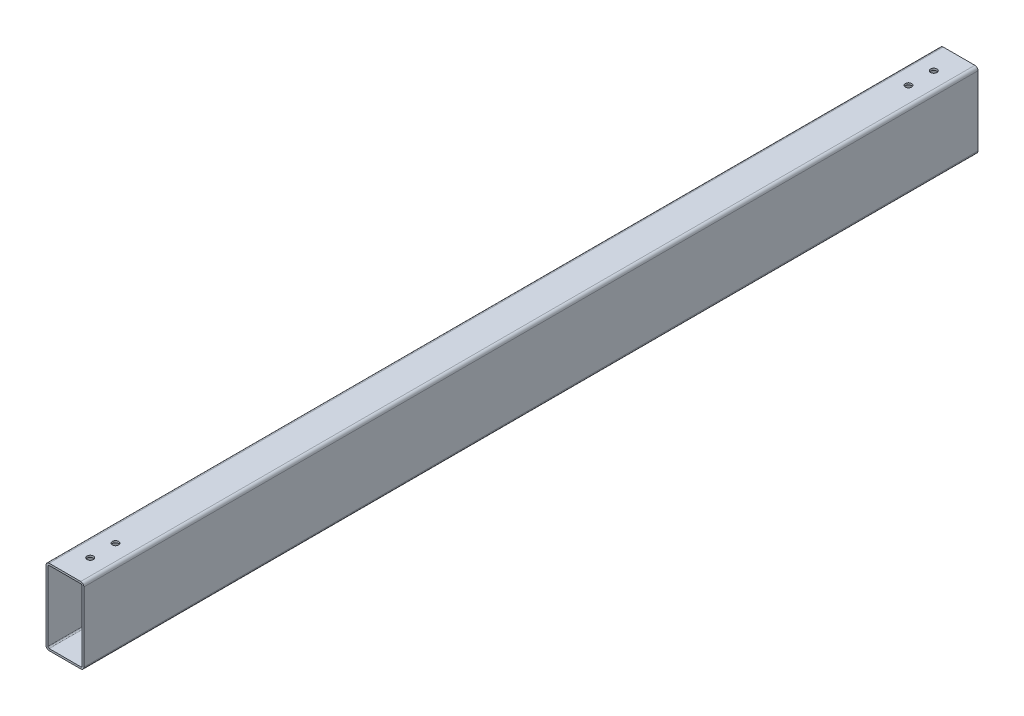
ISO-10303-21;
HEADER;
FILE_DESCRIPTION(('STEP AP214'),'2;1');
FILE_NAME('part.step','',(''),(''),'','','');
FILE_SCHEMA(('AUTOMOTIVE_DESIGN { 1 0 10303 214 1 1 1 1 }'));
ENDSEC;
DATA;
#1=APPLICATION_CONTEXT('core data for automotive mechanical design processes');
#2=APPLICATION_PROTOCOL_DEFINITION('international standard','automotive_design',2000,#1);
#3=PRODUCT_CONTEXT('',#1,'mechanical');
#4=PRODUCT('Part','Part','',(#3));
#5=PRODUCT_RELATED_PRODUCT_CATEGORY('part','',(#4));
#6=PRODUCT_DEFINITION_FORMATION('','',#4);
#7=PRODUCT_DEFINITION_CONTEXT('part definition',#1,'design');
#8=PRODUCT_DEFINITION('design','',#6,#7);
#9=PRODUCT_DEFINITION_SHAPE('','',#8);
#10=(LENGTH_UNIT() NAMED_UNIT(*) SI_UNIT(.MILLI.,.METRE.));
#11=(NAMED_UNIT(*) PLANE_ANGLE_UNIT() SI_UNIT($,.RADIAN.));
#12=(NAMED_UNIT(*) SI_UNIT($,.STERADIAN.) SOLID_ANGLE_UNIT());
#13=UNCERTAINTY_MEASURE_WITH_UNIT(LENGTH_MEASURE(1.E-05),#10,'distance_accuracy_value','');
#14=(GEOMETRIC_REPRESENTATION_CONTEXT(3) GLOBAL_UNCERTAINTY_ASSIGNED_CONTEXT((#13)) GLOBAL_UNIT_ASSIGNED_CONTEXT((#10,
#11,#12)) REPRESENTATION_CONTEXT('',''));
#15=CARTESIAN_POINT('',(0.,0.,0.));
#16=DIRECTION('',(0.,0.,1.));
#17=DIRECTION('',(1.,0.,0.));
#18=AXIS2_PLACEMENT_3D('',#15,#16,#17);
#19=CARTESIAN_POINT('',(-25.,55.,-708.));
#20=DIRECTION('',(0.,0.,1.));
#21=DIRECTION('',(1.,0.,0.));
#22=AXIS2_PLACEMENT_3D('',#19,#20,#21);
#23=CYLINDRICAL_SURFACE('',#22,5.);
#24=DIRECTION('',(0.,0.,1.));
#25=VECTOR('',#24,1.);
#26=CARTESIAN_POINT('',(-30.,55.,-708.));
#27=LINE('',#26,#25);
#28=CARTESIAN_POINT('',(-30.,55.,-708.));
#29=VERTEX_POINT('',#28);
#30=CARTESIAN_POINT('',(-30.,55.,708.));
#31=VERTEX_POINT('',#30);
#32=EDGE_CURVE('E132',#29,#31,#27,.T.);
#33=ORIENTED_EDGE('',*,*,#32,.T.);
#34=CARTESIAN_POINT('',(-25.,55.,708.));
#35=DIRECTION('',(0.,0.,1.));
#36=DIRECTION('',(-1.,0.,0.));
#37=AXIS2_PLACEMENT_3D('',#34,#35,#36);
#38=CIRCLE('',#37,5.);
#39=CARTESIAN_POINT('',(-25.,60.,708.));
#40=VERTEX_POINT('',#39);
#41=EDGE_CURVE('E287',#40,#31,#38,.T.);
#42=ORIENTED_EDGE('',*,*,#41,.F.);
#43=DIRECTION('',(0.,0.,1.));
#44=VECTOR('',#43,1.);
#45=CARTESIAN_POINT('',(-25.,60.,-708.));
#46=LINE('',#45,#44);
#47=CARTESIAN_POINT('',(-25.,60.,-708.));
#48=VERTEX_POINT('',#47);
#49=EDGE_CURVE('E12',#48,#40,#46,.T.);
#50=ORIENTED_EDGE('',*,*,#49,.F.);
#51=CARTESIAN_POINT('',(-25.,55.,-708.));
#52=DIRECTION('',(0.,0.,1.));
#53=DIRECTION('',(-1.,0.,0.));
#54=AXIS2_PLACEMENT_3D('',#51,#52,#53);
#55=CIRCLE('',#54,5.);
#56=EDGE_CURVE('E330',#48,#29,#55,.T.);
#57=ORIENTED_EDGE('',*,*,#56,.T.);
#58=EDGE_LOOP('',(#33,#42,#50,#57));
#59=FACE_BOUND('',#58,.T.);
#60=ADVANCED_FACE('F129',(#59),#23,.T.);
#61=CARTESIAN_POINT('',(-25.,60.,-708.));
#62=DIRECTION('',(0.,1.,0.));
#63=DIRECTION('',(0.,0.,1.));
#64=AXIS2_PLACEMENT_3D('',#61,#62,#63);
#65=PLANE('',#64);
#66=CARTESIAN_POINT('',(0.,60.,-668.));
#67=DIRECTION('',(0.,1.,0.));
#68=DIRECTION('',(0.,0.,1.));
#69=AXIS2_PLACEMENT_3D('',#66,#67,#68);
#70=CIRCLE('',#69,5.);
#71=CARTESIAN_POINT('',(0.,60.,-663.));
#72=VERTEX_POINT('',#71);
#73=EDGE_CURVE('E609',#72,#72,#70,.T.);
#74=ORIENTED_EDGE('',*,*,#73,.F.);
#75=EDGE_LOOP('',(#74));
#76=FACE_BOUND('',#75,.T.);
#77=CARTESIAN_POINT('',(0.,60.,-628.));
#78=DIRECTION('',(0.,1.,0.));
#79=DIRECTION('',(0.,0.,1.));
#80=AXIS2_PLACEMENT_3D('',#77,#78,#79);
#81=CIRCLE('',#80,5.);
#82=CARTESIAN_POINT('',(0.,60.,-623.));
#83=VERTEX_POINT('',#82);
#84=EDGE_CURVE('E616',#83,#83,#81,.T.);
#85=ORIENTED_EDGE('',*,*,#84,.F.);
#86=EDGE_LOOP('',(#85));
#87=FACE_BOUND('',#86,.T.);
#88=CARTESIAN_POINT('',(0.,60.,628.));
#89=DIRECTION('',(0.,1.,0.));
#90=DIRECTION('',(0.,0.,-1.));
#91=AXIS2_PLACEMENT_3D('',#88,#89,#90);
#92=CIRCLE('',#91,5.);
#93=CARTESIAN_POINT('',(0.,60.,623.));
#94=VERTEX_POINT('',#93);
#95=EDGE_CURVE('E622',#94,#94,#92,.T.);
#96=ORIENTED_EDGE('',*,*,#95,.F.);
#97=EDGE_LOOP('',(#96));
#98=FACE_BOUND('',#97,.T.);
#99=CARTESIAN_POINT('',(0.,60.,668.));
#100=DIRECTION('',(0.,1.,0.));
#101=DIRECTION('',(0.,0.,-1.));
#102=AXIS2_PLACEMENT_3D('',#99,#100,#101);
#103=CIRCLE('',#102,5.);
#104=CARTESIAN_POINT('',(0.,60.,663.));
#105=VERTEX_POINT('',#104);
#106=EDGE_CURVE('E628',#105,#105,#103,.T.);
#107=ORIENTED_EDGE('',*,*,#106,.F.);
#108=EDGE_LOOP('',(#107));
#109=FACE_BOUND('',#108,.T.);
#110=ORIENTED_EDGE('',*,*,#49,.T.);
#111=DIRECTION('',(-1.,0.,0.));
#112=VECTOR('',#111,1.);
#113=CARTESIAN_POINT('',(-25.,60.,708.));
#114=LINE('',#113,#112);
#115=CARTESIAN_POINT('',(25.,60.,708.));
#116=VERTEX_POINT('',#115);
#117=EDGE_CURVE('E308',#116,#40,#114,.T.);
#118=ORIENTED_EDGE('',*,*,#117,.F.);
#119=DIRECTION('',(0.,0.,1.));
#120=VECTOR('',#119,1.);
#121=CARTESIAN_POINT('',(25.,60.,-708.));
#122=LINE('',#121,#120);
#123=CARTESIAN_POINT('',(25.,60.,-708.));
#124=VERTEX_POINT('',#123);
#125=EDGE_CURVE('E137',#124,#116,#122,.T.);
#126=ORIENTED_EDGE('',*,*,#125,.F.);
#127=DIRECTION('',(-1.,0.,0.));
#128=VECTOR('',#127,1.);
#129=CARTESIAN_POINT('',(-25.,60.,-708.));
#130=LINE('',#129,#128);
#131=EDGE_CURVE('E361',#124,#48,#130,.T.);
#132=ORIENTED_EDGE('',*,*,#131,.T.);
#133=EDGE_LOOP('',(#110,#118,#126,#132));
#134=FACE_BOUND('',#133,.T.);
#135=ADVANCED_FACE('F382',(#76,#87,#98,#109,#134),#65,.T.);
#136=CARTESIAN_POINT('',(25.,55.,-708.));
#137=DIRECTION('',(0.,0.,1.));
#138=DIRECTION('',(1.,0.,0.));
#139=AXIS2_PLACEMENT_3D('',#136,#137,#138);
#140=CYLINDRICAL_SURFACE('',#139,5.);
#141=ORIENTED_EDGE('',*,*,#125,.T.);
#142=CARTESIAN_POINT('',(25.,55.,708.));
#143=DIRECTION('',(0.,0.,1.));
#144=DIRECTION('',(-1.,0.,0.));
#145=AXIS2_PLACEMENT_3D('',#142,#143,#144);
#146=CIRCLE('',#145,5.);
#147=CARTESIAN_POINT('',(30.,55.,708.));
#148=VERTEX_POINT('',#147);
#149=EDGE_CURVE('E305',#148,#116,#146,.T.);
#150=ORIENTED_EDGE('',*,*,#149,.F.);
#151=DIRECTION('',(0.,0.,1.));
#152=VECTOR('',#151,1.);
#153=CARTESIAN_POINT('',(30.,55.,-708.));
#154=LINE('',#153,#152);
#155=CARTESIAN_POINT('',(30.,55.,-708.));
#156=VERTEX_POINT('',#155);
#157=EDGE_CURVE('E365',#156,#148,#154,.T.);
#158=ORIENTED_EDGE('',*,*,#157,.F.);
#159=CARTESIAN_POINT('',(25.,55.,-708.));
#160=DIRECTION('',(0.,0.,1.));
#161=DIRECTION('',(-1.,0.,0.));
#162=AXIS2_PLACEMENT_3D('',#159,#160,#161);
#163=CIRCLE('',#162,5.);
#164=EDGE_CURVE('E358',#156,#124,#163,.T.);
#165=ORIENTED_EDGE('',*,*,#164,.T.);
#166=EDGE_LOOP('',(#141,#150,#158,#165));
#167=FACE_BOUND('',#166,.T.);
#168=ADVANCED_FACE('F403',(#167),#140,.T.);
#169=CARTESIAN_POINT('',(30.,-55.,-708.));
#170=DIRECTION('',(1.,0.,0.));
#171=DIRECTION('',(0.,0.,-1.));
#172=AXIS2_PLACEMENT_3D('',#169,#170,#171);
#173=PLANE('',#172);
#174=ORIENTED_EDGE('',*,*,#157,.T.);
#175=DIRECTION('',(0.,1.,0.));
#176=VECTOR('',#175,1.);
#177=CARTESIAN_POINT('',(30.,-55.,708.));
#178=LINE('',#177,#176);
#179=CARTESIAN_POINT('',(30.,-55.,708.));
#180=VERTEX_POINT('',#179);
#181=EDGE_CURVE('E302',#180,#148,#178,.T.);
#182=ORIENTED_EDGE('',*,*,#181,.F.);
#183=DIRECTION('',(0.,0.,1.));
#184=VECTOR('',#183,1.);
#185=CARTESIAN_POINT('',(30.,-55.,-708.));
#186=LINE('',#185,#184);
#187=CARTESIAN_POINT('',(30.,-55.,-708.));
#188=VERTEX_POINT('',#187);
#189=EDGE_CURVE('E367',#188,#180,#186,.T.);
#190=ORIENTED_EDGE('',*,*,#189,.F.);
#191=DIRECTION('',(0.,1.,0.));
#192=VECTOR('',#191,1.);
#193=CARTESIAN_POINT('',(30.,-55.,-708.));
#194=LINE('',#193,#192);
#195=EDGE_CURVE('E355',#188,#156,#194,.T.);
#196=ORIENTED_EDGE('',*,*,#195,.T.);
#197=EDGE_LOOP('',(#174,#182,#190,#196));
#198=FACE_BOUND('',#197,.T.);
#199=ADVANCED_FACE('F400',(#198),#173,.T.);
#200=CARTESIAN_POINT('',(25.,-55.,-708.));
#201=DIRECTION('',(0.,0.,1.));
#202=DIRECTION('',(1.,0.,0.));
#203=AXIS2_PLACEMENT_3D('',#200,#201,#202);
#204=CYLINDRICAL_SURFACE('',#203,5.);
#205=ORIENTED_EDGE('',*,*,#189,.T.);
#206=CARTESIAN_POINT('',(25.,-55.,708.));
#207=DIRECTION('',(0.,0.,1.));
#208=DIRECTION('',(-1.,0.,0.));
#209=AXIS2_PLACEMENT_3D('',#206,#207,#208);
#210=CIRCLE('',#209,5.);
#211=CARTESIAN_POINT('',(25.,-60.,708.));
#212=VERTEX_POINT('',#211);
#213=EDGE_CURVE('E299',#212,#180,#210,.T.);
#214=ORIENTED_EDGE('',*,*,#213,.F.);
#215=DIRECTION('',(0.,0.,1.));
#216=VECTOR('',#215,1.);
#217=CARTESIAN_POINT('',(25.,-60.,-708.));
#218=LINE('',#217,#216);
#219=CARTESIAN_POINT('',(25.,-60.,-708.));
#220=VERTEX_POINT('',#219);
#221=EDGE_CURVE('E369',#220,#212,#218,.T.);
#222=ORIENTED_EDGE('',*,*,#221,.F.);
#223=CARTESIAN_POINT('',(25.,-55.,-708.));
#224=DIRECTION('',(0.,0.,1.));
#225=DIRECTION('',(-1.,0.,0.));
#226=AXIS2_PLACEMENT_3D('',#223,#224,#225);
#227=CIRCLE('',#226,5.);
#228=EDGE_CURVE('E352',#220,#188,#227,.T.);
#229=ORIENTED_EDGE('',*,*,#228,.T.);
#230=EDGE_LOOP('',(#205,#214,#222,#229));
#231=FACE_BOUND('',#230,.T.);
#232=ADVANCED_FACE('F398',(#231),#204,.T.);
#233=CARTESIAN_POINT('',(-25.,-60.,-708.));
#234=DIRECTION('',(0.,-1.,0.));
#235=DIRECTION('',(0.,0.,-1.));
#236=AXIS2_PLACEMENT_3D('',#233,#234,#235);
#237=PLANE('',#236);
#238=ORIENTED_EDGE('',*,*,#221,.T.);
#239=DIRECTION('',(1.,0.,0.));
#240=VECTOR('',#239,1.);
#241=CARTESIAN_POINT('',(-25.,-60.,708.));
#242=LINE('',#241,#240);
#243=CARTESIAN_POINT('',(-25.,-60.,708.));
#244=VERTEX_POINT('',#243);
#245=EDGE_CURVE('E296',#244,#212,#242,.T.);
#246=ORIENTED_EDGE('',*,*,#245,.F.);
#247=DIRECTION('',(0.,0.,1.));
#248=VECTOR('',#247,1.);
#249=CARTESIAN_POINT('',(-25.,-60.,-708.));
#250=LINE('',#249,#248);
#251=CARTESIAN_POINT('',(-25.,-60.,-708.));
#252=VERTEX_POINT('',#251);
#253=EDGE_CURVE('E371',#252,#244,#250,.T.);
#254=ORIENTED_EDGE('',*,*,#253,.F.);
#255=DIRECTION('',(1.,0.,0.));
#256=VECTOR('',#255,1.);
#257=CARTESIAN_POINT('',(-25.,-60.,-708.));
#258=LINE('',#257,#256);
#259=EDGE_CURVE('E349',#252,#220,#258,.T.);
#260=ORIENTED_EDGE('',*,*,#259,.T.);
#261=EDGE_LOOP('',(#238,#246,#254,#260));
#262=FACE_BOUND('',#261,.T.);
#263=ADVANCED_FACE('F396',(#262),#237,.T.);
#264=CARTESIAN_POINT('',(-25.,-55.,-708.));
#265=DIRECTION('',(0.,0.,1.));
#266=DIRECTION('',(1.,0.,0.));
#267=AXIS2_PLACEMENT_3D('',#264,#265,#266);
#268=CYLINDRICAL_SURFACE('',#267,5.);
#269=ORIENTED_EDGE('',*,*,#253,.T.);
#270=CARTESIAN_POINT('',(-25.,-55.,708.));
#271=DIRECTION('',(0.,0.,1.));
#272=DIRECTION('',(-1.,0.,0.));
#273=AXIS2_PLACEMENT_3D('',#270,#271,#272);
#274=CIRCLE('',#273,5.);
#275=CARTESIAN_POINT('',(-30.,-55.,708.));
#276=VERTEX_POINT('',#275);
#277=EDGE_CURVE('E293',#276,#244,#274,.T.);
#278=ORIENTED_EDGE('',*,*,#277,.F.);
#279=DIRECTION('',(0.,0.,1.));
#280=VECTOR('',#279,1.);
#281=CARTESIAN_POINT('',(-30.,-55.,-708.));
#282=LINE('',#281,#280);
#283=CARTESIAN_POINT('',(-30.,-55.,-708.));
#284=VERTEX_POINT('',#283);
#285=EDGE_CURVE('E372',#284,#276,#282,.T.);
#286=ORIENTED_EDGE('',*,*,#285,.F.);
#287=CARTESIAN_POINT('',(-25.,-55.,-708.));
#288=DIRECTION('',(0.,0.,1.));
#289=DIRECTION('',(-1.,0.,0.));
#290=AXIS2_PLACEMENT_3D('',#287,#288,#289);
#291=CIRCLE('',#290,5.);
#292=EDGE_CURVE('E346',#284,#252,#291,.T.);
#293=ORIENTED_EDGE('',*,*,#292,.T.);
#294=EDGE_LOOP('',(#269,#278,#286,#293));
#295=FACE_BOUND('',#294,.T.);
#296=ADVANCED_FACE('F392',(#295),#268,.T.);
#297=CARTESIAN_POINT('',(-30.,-55.,-708.));
#298=DIRECTION('',(-1.,0.,0.));
#299=DIRECTION('',(0.,0.,1.));
#300=AXIS2_PLACEMENT_3D('',#297,#298,#299);
#301=PLANE('',#300);
#302=ORIENTED_EDGE('',*,*,#285,.T.);
#303=DIRECTION('',(0.,-1.,0.));
#304=VECTOR('',#303,1.);
#305=CARTESIAN_POINT('',(-30.,-55.,708.));
#306=LINE('',#305,#304);
#307=EDGE_CURVE('E290',#31,#276,#306,.T.);
#308=ORIENTED_EDGE('',*,*,#307,.F.);
#309=ORIENTED_EDGE('',*,*,#32,.F.);
#310=DIRECTION('',(0.,-1.,0.));
#311=VECTOR('',#310,1.);
#312=CARTESIAN_POINT('',(-30.,-55.,-708.));
#313=LINE('',#312,#311);
#314=EDGE_CURVE('E343',#29,#284,#313,.T.);
#315=ORIENTED_EDGE('',*,*,#314,.T.);
#316=EDGE_LOOP('',(#302,#308,#309,#315));
#317=FACE_BOUND('',#316,.T.);
#318=ADVANCED_FACE('F376',(#317),#301,.T.);
#319=CARTESIAN_POINT('',(-25.,55.,-708.));
#320=DIRECTION('',(0.,0.,1.));
#321=DIRECTION('',(1.,0.,0.));
#322=AXIS2_PLACEMENT_3D('',#319,#320,#321);
#323=PLANE('',#322);
#324=DIRECTION('',(-1.,0.,0.));
#325=VECTOR('',#324,1.);
#326=CARTESIAN_POINT('',(-25.,57.,-708.));
#327=LINE('',#326,#325);
#328=CARTESIAN_POINT('',(25.,57.,-708.));
#329=VERTEX_POINT('',#328);
#330=CARTESIAN_POINT('',(-25.,57.,-708.));
#331=VERTEX_POINT('',#330);
#332=EDGE_CURVE('E254',#329,#331,#327,.T.);
#333=ORIENTED_EDGE('',*,*,#332,.T.);
#334=CARTESIAN_POINT('',(-25.,55.,-708.));
#335=DIRECTION('',(0.,0.,-1.));
#336=DIRECTION('',(-1.,0.,0.));
#337=AXIS2_PLACEMENT_3D('',#334,#335,#336);
#338=CIRCLE('',#337,2.);
#339=CARTESIAN_POINT('',(-27.,55.,-708.));
#340=VERTEX_POINT('',#339);
#341=EDGE_CURVE('E311',#331,#340,#338,.F.);
#342=ORIENTED_EDGE('',*,*,#341,.T.);
#343=DIRECTION('',(0.,-1.,0.));
#344=VECTOR('',#343,1.);
#345=CARTESIAN_POINT('',(-27.,55.,-708.));
#346=LINE('',#345,#344);
#347=CARTESIAN_POINT('',(-27.,-55.,-708.));
#348=VERTEX_POINT('',#347);
#349=EDGE_CURVE('E249',#340,#348,#346,.T.);
#350=ORIENTED_EDGE('',*,*,#349,.T.);
#351=CARTESIAN_POINT('',(-25.,-55.,-708.));
#352=DIRECTION('',(0.,0.,-1.));
#353=DIRECTION('',(-1.,0.,0.));
#354=AXIS2_PLACEMENT_3D('',#351,#352,#353);
#355=CIRCLE('',#354,2.);
#356=CARTESIAN_POINT('',(-25.,-57.,-708.));
#357=VERTEX_POINT('',#356);
#358=EDGE_CURVE('E145',#348,#357,#355,.F.);
#359=ORIENTED_EDGE('',*,*,#358,.T.);
#360=DIRECTION('',(1.,0.,0.));
#361=VECTOR('',#360,1.);
#362=CARTESIAN_POINT('',(-25.,-57.,-708.));
#363=LINE('',#362,#361);
#364=CARTESIAN_POINT('',(25.,-57.,-708.));
#365=VERTEX_POINT('',#364);
#366=EDGE_CURVE('E315',#357,#365,#363,.T.);
#367=ORIENTED_EDGE('',*,*,#366,.T.);
#368=CARTESIAN_POINT('',(25.,-55.,-708.));
#369=DIRECTION('',(0.,0.,-1.));
#370=DIRECTION('',(-1.,0.,0.));
#371=AXIS2_PLACEMENT_3D('',#368,#369,#370);
#372=CIRCLE('',#371,2.);
#373=CARTESIAN_POINT('',(27.,-55.,-708.));
#374=VERTEX_POINT('',#373);
#375=EDGE_CURVE('E318',#365,#374,#372,.F.);
#376=ORIENTED_EDGE('',*,*,#375,.T.);
#377=DIRECTION('',(0.,1.,0.));
#378=VECTOR('',#377,1.);
#379=CARTESIAN_POINT('',(27.,55.,-708.));
#380=LINE('',#379,#378);
#381=CARTESIAN_POINT('',(27.,55.,-708.));
#382=VERTEX_POINT('',#381);
#383=EDGE_CURVE('E321',#374,#382,#380,.T.);
#384=ORIENTED_EDGE('',*,*,#383,.T.);
#385=CARTESIAN_POINT('',(25.,55.,-708.));
#386=DIRECTION('',(0.,0.,-1.));
#387=DIRECTION('',(-1.,0.,0.));
#388=AXIS2_PLACEMENT_3D('',#385,#386,#387);
#389=CIRCLE('',#388,2.);
#390=EDGE_CURVE('E324',#382,#329,#389,.F.);
#391=ORIENTED_EDGE('',*,*,#390,.T.);
#392=EDGE_LOOP('',(#333,#342,#350,#359,#367,#376,#384,#391));
#393=FACE_BOUND('',#392,.T.);
#394=ORIENTED_EDGE('',*,*,#56,.F.);
#395=ORIENTED_EDGE('',*,*,#131,.F.);
#396=ORIENTED_EDGE('',*,*,#164,.F.);
#397=ORIENTED_EDGE('',*,*,#195,.F.);
#398=ORIENTED_EDGE('',*,*,#228,.F.);
#399=ORIENTED_EDGE('',*,*,#259,.F.);
#400=ORIENTED_EDGE('',*,*,#292,.F.);
#401=ORIENTED_EDGE('',*,*,#314,.F.);
#402=EDGE_LOOP('',(#394,#395,#396,#397,#398,#399,#400,#401));
#403=FACE_BOUND('',#402,.T.);
#404=ADVANCED_FACE('F386',(#393,#403),#323,.F.);
#405=CARTESIAN_POINT('',(-25.,55.,-708.));
#406=DIRECTION('',(0.,0.,1.));
#407=DIRECTION('',(1.,0.,0.));
#408=AXIS2_PLACEMENT_3D('',#405,#406,#407);
#409=CYLINDRICAL_SURFACE('',#408,2.);
#410=DIRECTION('',(0.,0.,1.));
#411=VECTOR('',#410,1.);
#412=CARTESIAN_POINT('',(-25.,57.,-708.));
#413=LINE('',#412,#411);
#414=CARTESIAN_POINT('',(-25.,57.,708.));
#415=VERTEX_POINT('',#414);
#416=EDGE_CURVE('E259',#331,#415,#413,.T.);
#417=ORIENTED_EDGE('',*,*,#416,.T.);
#418=CARTESIAN_POINT('',(-25.,55.,708.));
#419=DIRECTION('',(0.,0.,-1.));
#420=DIRECTION('',(-1.,0.,0.));
#421=AXIS2_PLACEMENT_3D('',#418,#419,#420);
#422=CIRCLE('',#421,2.);
#423=CARTESIAN_POINT('',(-27.,55.,708.));
#424=VERTEX_POINT('',#423);
#425=EDGE_CURVE('E257',#415,#424,#422,.F.);
#426=ORIENTED_EDGE('',*,*,#425,.T.);
#427=DIRECTION('',(0.,0.,1.));
#428=VECTOR('',#427,1.);
#429=CARTESIAN_POINT('',(-27.,55.,-708.));
#430=LINE('',#429,#428);
#431=EDGE_CURVE('E242',#340,#424,#430,.T.);
#432=ORIENTED_EDGE('',*,*,#431,.F.);
#433=ORIENTED_EDGE('',*,*,#341,.F.);
#434=EDGE_LOOP('',(#417,#426,#432,#433));
#435=FACE_BOUND('',#434,.T.);
#436=ADVANCED_FACE('F258',(#435),#409,.F.);
#437=CARTESIAN_POINT('',(-25.,57.,-708.));
#438=DIRECTION('',(0.,1.,0.));
#439=DIRECTION('',(0.,0.,1.));
#440=AXIS2_PLACEMENT_3D('',#437,#438,#439);
#441=PLANE('',#440);
#442=CARTESIAN_POINT('',(0.,57.,-668.));
#443=DIRECTION('',(0.,1.,0.));
#444=DIRECTION('',(0.,0.,1.));
#445=AXIS2_PLACEMENT_3D('',#442,#443,#444);
#446=CIRCLE('',#445,5.);
#447=CARTESIAN_POINT('',(0.,57.,-663.));
#448=VERTEX_POINT('',#447);
#449=EDGE_CURVE('E263',#448,#448,#446,.F.);
#450=ORIENTED_EDGE('',*,*,#449,.F.);
#451=EDGE_LOOP('',(#450));
#452=FACE_BOUND('',#451,.T.);
#453=CARTESIAN_POINT('',(0.,57.,-628.));
#454=DIRECTION('',(0.,1.,0.));
#455=DIRECTION('',(0.,0.,1.));
#456=AXIS2_PLACEMENT_3D('',#453,#454,#455);
#457=CIRCLE('',#456,5.);
#458=CARTESIAN_POINT('',(0.,57.,-623.));
#459=VERTEX_POINT('',#458);
#460=EDGE_CURVE('E613',#459,#459,#457,.F.);
#461=ORIENTED_EDGE('',*,*,#460,.F.);
#462=EDGE_LOOP('',(#461));
#463=FACE_BOUND('',#462,.T.);
#464=CARTESIAN_POINT('',(0.,57.,628.));
#465=DIRECTION('',(0.,1.,0.));
#466=DIRECTION('',(0.,0.,1.));
#467=AXIS2_PLACEMENT_3D('',#464,#465,#466);
#468=CIRCLE('',#467,5.);
#469=CARTESIAN_POINT('',(0.,57.,633.));
#470=VERTEX_POINT('',#469);
#471=EDGE_CURVE('E619',#470,#470,#468,.F.);
#472=ORIENTED_EDGE('',*,*,#471,.F.);
#473=EDGE_LOOP('',(#472));
#474=FACE_BOUND('',#473,.T.);
#475=CARTESIAN_POINT('',(0.,57.,668.));
#476=DIRECTION('',(0.,1.,0.));
#477=DIRECTION('',(0.,0.,1.));
#478=AXIS2_PLACEMENT_3D('',#475,#476,#477);
#479=CIRCLE('',#478,5.);
#480=CARTESIAN_POINT('',(0.,57.,673.));
#481=VERTEX_POINT('',#480);
#482=EDGE_CURVE('E625',#481,#481,#479,.F.);
#483=ORIENTED_EDGE('',*,*,#482,.F.);
#484=EDGE_LOOP('',(#483));
#485=FACE_BOUND('',#484,.T.);
#486=DIRECTION('',(0.,0.,1.));
#487=VECTOR('',#486,1.);
#488=CARTESIAN_POINT('',(25.,57.,-708.));
#489=LINE('',#488,#487);
#490=CARTESIAN_POINT('',(25.,57.,708.));
#491=VERTEX_POINT('',#490);
#492=EDGE_CURVE('E331',#329,#491,#489,.T.);
#493=ORIENTED_EDGE('',*,*,#492,.T.);
#494=DIRECTION('',(-1.,0.,0.));
#495=VECTOR('',#494,1.);
#496=CARTESIAN_POINT('',(-25.,57.,708.));
#497=LINE('',#496,#495);
#498=EDGE_CURVE('E285',#491,#415,#497,.T.);
#499=ORIENTED_EDGE('',*,*,#498,.T.);
#500=ORIENTED_EDGE('',*,*,#416,.F.);
#501=ORIENTED_EDGE('',*,*,#332,.F.);
#502=EDGE_LOOP('',(#493,#499,#500,#501));
#503=FACE_BOUND('',#502,.T.);
#504=ADVANCED_FACE('F431',(#452,#463,#474,#485,#503),#441,.F.);
#505=CARTESIAN_POINT('',(25.,55.,-708.));
#506=DIRECTION('',(0.,0.,1.));
#507=DIRECTION('',(1.,0.,0.));
#508=AXIS2_PLACEMENT_3D('',#505,#506,#507);
#509=CYLINDRICAL_SURFACE('',#508,2.);
#510=DIRECTION('',(0.,0.,1.));
#511=VECTOR('',#510,1.);
#512=CARTESIAN_POINT('',(27.,55.,-708.));
#513=LINE('',#512,#511);
#514=CARTESIAN_POINT('',(27.,55.,708.));
#515=VERTEX_POINT('',#514);
#516=EDGE_CURVE('E333',#382,#515,#513,.T.);
#517=ORIENTED_EDGE('',*,*,#516,.T.);
#518=CARTESIAN_POINT('',(25.,55.,708.));
#519=DIRECTION('',(0.,0.,-1.));
#520=DIRECTION('',(-1.,0.,0.));
#521=AXIS2_PLACEMENT_3D('',#518,#519,#520);
#522=CIRCLE('',#521,2.);
#523=EDGE_CURVE('E282',#515,#491,#522,.F.);
#524=ORIENTED_EDGE('',*,*,#523,.T.);
#525=ORIENTED_EDGE('',*,*,#492,.F.);
#526=ORIENTED_EDGE('',*,*,#390,.F.);
#527=EDGE_LOOP('',(#517,#524,#525,#526));
#528=FACE_BOUND('',#527,.T.);
#529=ADVANCED_FACE('F436',(#528),#509,.F.);
#530=CARTESIAN_POINT('',(27.,55.,-708.));
#531=DIRECTION('',(1.,0.,0.));
#532=DIRECTION('',(0.,0.,-1.));
#533=AXIS2_PLACEMENT_3D('',#530,#531,#532);
#534=PLANE('',#533);
#535=DIRECTION('',(0.,0.,1.));
#536=VECTOR('',#535,1.);
#537=CARTESIAN_POINT('',(27.,-55.,-708.));
#538=LINE('',#537,#536);
#539=CARTESIAN_POINT('',(27.,-55.,708.));
#540=VERTEX_POINT('',#539);
#541=EDGE_CURVE('E335',#374,#540,#538,.T.);
#542=ORIENTED_EDGE('',*,*,#541,.T.);
#543=DIRECTION('',(0.,1.,0.));
#544=VECTOR('',#543,1.);
#545=CARTESIAN_POINT('',(27.,55.,708.));
#546=LINE('',#545,#544);
#547=EDGE_CURVE('E279',#540,#515,#546,.T.);
#548=ORIENTED_EDGE('',*,*,#547,.T.);
#549=ORIENTED_EDGE('',*,*,#516,.F.);
#550=ORIENTED_EDGE('',*,*,#383,.F.);
#551=EDGE_LOOP('',(#542,#548,#549,#550));
#552=FACE_BOUND('',#551,.T.);
#553=ADVANCED_FACE('F490',(#552),#534,.F.);
#554=CARTESIAN_POINT('',(25.,-55.,-708.));
#555=DIRECTION('',(0.,0.,1.));
#556=DIRECTION('',(1.,0.,0.));
#557=AXIS2_PLACEMENT_3D('',#554,#555,#556);
#558=CYLINDRICAL_SURFACE('',#557,2.);
#559=DIRECTION('',(0.,0.,1.));
#560=VECTOR('',#559,1.);
#561=CARTESIAN_POINT('',(25.,-57.,-708.));
#562=LINE('',#561,#560);
#563=CARTESIAN_POINT('',(25.,-57.,708.));
#564=VERTEX_POINT('',#563);
#565=EDGE_CURVE('E337',#365,#564,#562,.T.);
#566=ORIENTED_EDGE('',*,*,#565,.T.);
#567=CARTESIAN_POINT('',(25.,-55.,708.));
#568=DIRECTION('',(0.,0.,-1.));
#569=DIRECTION('',(-1.,0.,0.));
#570=AXIS2_PLACEMENT_3D('',#567,#568,#569);
#571=CIRCLE('',#570,2.);
#572=EDGE_CURVE('E276',#564,#540,#571,.F.);
#573=ORIENTED_EDGE('',*,*,#572,.T.);
#574=ORIENTED_EDGE('',*,*,#541,.F.);
#575=ORIENTED_EDGE('',*,*,#375,.F.);
#576=EDGE_LOOP('',(#566,#573,#574,#575));
#577=FACE_BOUND('',#576,.T.);
#578=ADVANCED_FACE('F494',(#577),#558,.F.);
#579=CARTESIAN_POINT('',(-25.,-57.,-708.));
#580=DIRECTION('',(0.,-1.,0.));
#581=DIRECTION('',(0.,0.,-1.));
#582=AXIS2_PLACEMENT_3D('',#579,#580,#581);
#583=PLANE('',#582);
#584=DIRECTION('',(0.,0.,1.));
#585=VECTOR('',#584,1.);
#586=CARTESIAN_POINT('',(-25.,-57.,-708.));
#587=LINE('',#586,#585);
#588=CARTESIAN_POINT('',(-25.,-57.,708.));
#589=VERTEX_POINT('',#588);
#590=EDGE_CURVE('E339',#357,#589,#587,.T.);
#591=ORIENTED_EDGE('',*,*,#590,.T.);
#592=DIRECTION('',(1.,0.,0.));
#593=VECTOR('',#592,1.);
#594=CARTESIAN_POINT('',(-25.,-57.,708.));
#595=LINE('',#594,#593);
#596=EDGE_CURVE('E270',#589,#564,#595,.T.);
#597=ORIENTED_EDGE('',*,*,#596,.T.);
#598=ORIENTED_EDGE('',*,*,#565,.F.);
#599=ORIENTED_EDGE('',*,*,#366,.F.);
#600=EDGE_LOOP('',(#591,#597,#598,#599));
#601=FACE_BOUND('',#600,.T.);
#602=ADVANCED_FACE('F498',(#601),#583,.F.);
#603=CARTESIAN_POINT('',(-25.,-55.,-708.));
#604=DIRECTION('',(0.,0.,1.));
#605=DIRECTION('',(1.,0.,0.));
#606=AXIS2_PLACEMENT_3D('',#603,#604,#605);
#607=CYLINDRICAL_SURFACE('',#606,2.);
#608=DIRECTION('',(0.,0.,1.));
#609=VECTOR('',#608,1.);
#610=CARTESIAN_POINT('',(-27.,-55.,-708.));
#611=LINE('',#610,#609);
#612=CARTESIAN_POINT('',(-27.,-55.,708.));
#613=VERTEX_POINT('',#612);
#614=EDGE_CURVE('E253',#348,#613,#611,.T.);
#615=ORIENTED_EDGE('',*,*,#614,.T.);
#616=CARTESIAN_POINT('',(-25.,-55.,708.));
#617=DIRECTION('',(0.,0.,-1.));
#618=DIRECTION('',(-1.,0.,0.));
#619=AXIS2_PLACEMENT_3D('',#616,#617,#618);
#620=CIRCLE('',#619,2.);
#621=EDGE_CURVE('E268',#613,#589,#620,.F.);
#622=ORIENTED_EDGE('',*,*,#621,.T.);
#623=ORIENTED_EDGE('',*,*,#590,.F.);
#624=ORIENTED_EDGE('',*,*,#358,.F.);
#625=EDGE_LOOP('',(#615,#622,#623,#624));
#626=FACE_BOUND('',#625,.T.);
#627=ADVANCED_FACE('F502',(#626),#607,.F.);
#628=CARTESIAN_POINT('',(-27.,55.,-708.));
#629=DIRECTION('',(-1.,0.,0.));
#630=DIRECTION('',(0.,0.,1.));
#631=AXIS2_PLACEMENT_3D('',#628,#629,#630);
#632=PLANE('',#631);
#633=ORIENTED_EDGE('',*,*,#431,.T.);
#634=DIRECTION('',(0.,-1.,0.));
#635=VECTOR('',#634,1.);
#636=CARTESIAN_POINT('',(-27.,55.,708.));
#637=LINE('',#636,#635);
#638=EDGE_CURVE('E246',#424,#613,#637,.T.);
#639=ORIENTED_EDGE('',*,*,#638,.T.);
#640=ORIENTED_EDGE('',*,*,#614,.F.);
#641=ORIENTED_EDGE('',*,*,#349,.F.);
#642=EDGE_LOOP('',(#633,#639,#640,#641));
#643=FACE_BOUND('',#642,.T.);
#644=ADVANCED_FACE('F244',(#643),#632,.F.);
#645=CARTESIAN_POINT('',(-25.,55.,708.));
#646=DIRECTION('',(0.,0.,1.));
#647=DIRECTION('',(1.,0.,0.));
#648=AXIS2_PLACEMENT_3D('',#645,#646,#647);
#649=PLANE('',#648);
#650=ORIENTED_EDGE('',*,*,#41,.T.);
#651=ORIENTED_EDGE('',*,*,#307,.T.);
#652=ORIENTED_EDGE('',*,*,#277,.T.);
#653=ORIENTED_EDGE('',*,*,#245,.T.);
#654=ORIENTED_EDGE('',*,*,#213,.T.);
#655=ORIENTED_EDGE('',*,*,#181,.T.);
#656=ORIENTED_EDGE('',*,*,#149,.T.);
#657=ORIENTED_EDGE('',*,*,#117,.T.);
#658=EDGE_LOOP('',(#650,#651,#652,#653,#654,#655,#656,#657));
#659=FACE_BOUND('',#658,.T.);
#660=ORIENTED_EDGE('',*,*,#638,.F.);
#661=ORIENTED_EDGE('',*,*,#425,.F.);
#662=ORIENTED_EDGE('',*,*,#498,.F.);
#663=ORIENTED_EDGE('',*,*,#523,.F.);
#664=ORIENTED_EDGE('',*,*,#547,.F.);
#665=ORIENTED_EDGE('',*,*,#572,.F.);
#666=ORIENTED_EDGE('',*,*,#596,.F.);
#667=ORIENTED_EDGE('',*,*,#621,.F.);
#668=EDGE_LOOP('',(#660,#661,#662,#663,#664,#665,#666,#667));
#669=FACE_BOUND('',#668,.T.);
#670=ADVANCED_FACE('F265',(#659,#669),#649,.T.);
#671=CARTESIAN_POINT('',(0.,-60.001,668.));
#672=DIRECTION('',(0.,1.,0.));
#673=DIRECTION('',(0.,0.,1.));
#674=AXIS2_PLACEMENT_3D('',#671,#672,#673);
#675=CYLINDRICAL_SURFACE('',#674,5.);
#676=ORIENTED_EDGE('',*,*,#106,.T.);
#677=EDGE_LOOP('',(#676));
#678=FACE_BOUND('',#677,.T.);
#679=ORIENTED_EDGE('',*,*,#482,.T.);
#680=EDGE_LOOP('',(#679));
#681=FACE_BOUND('',#680,.T.);
#682=ADVANCED_FACE('F446',(#678,#681),#675,.F.);
#683=CARTESIAN_POINT('',(0.,-60.001,628.));
#684=DIRECTION('',(0.,1.,0.));
#685=DIRECTION('',(0.,0.,1.));
#686=AXIS2_PLACEMENT_3D('',#683,#684,#685);
#687=CYLINDRICAL_SURFACE('',#686,5.);
#688=ORIENTED_EDGE('',*,*,#95,.T.);
#689=EDGE_LOOP('',(#688));
#690=FACE_BOUND('',#689,.T.);
#691=ORIENTED_EDGE('',*,*,#471,.T.);
#692=EDGE_LOOP('',(#691));
#693=FACE_BOUND('',#692,.T.);
#694=ADVANCED_FACE('F451',(#690,#693),#687,.F.);
#695=CARTESIAN_POINT('',(0.,-60.001,-628.));
#696=DIRECTION('',(0.,1.,0.));
#697=DIRECTION('',(0.,0.,1.));
#698=AXIS2_PLACEMENT_3D('',#695,#696,#697);
#699=CYLINDRICAL_SURFACE('',#698,5.);
#700=ORIENTED_EDGE('',*,*,#84,.T.);
#701=EDGE_LOOP('',(#700));
#702=FACE_BOUND('',#701,.T.);
#703=ORIENTED_EDGE('',*,*,#460,.T.);
#704=EDGE_LOOP('',(#703));
#705=FACE_BOUND('',#704,.T.);
#706=ADVANCED_FACE('F461',(#702,#705),#699,.F.);
#707=CARTESIAN_POINT('',(0.,-60.001,-668.));
#708=DIRECTION('',(0.,1.,0.));
#709=DIRECTION('',(0.,0.,1.));
#710=AXIS2_PLACEMENT_3D('',#707,#708,#709);
#711=CYLINDRICAL_SURFACE('',#710,5.);
#712=ORIENTED_EDGE('',*,*,#73,.T.);
#713=EDGE_LOOP('',(#712));
#714=FACE_BOUND('',#713,.T.);
#715=ORIENTED_EDGE('',*,*,#449,.T.);
#716=EDGE_LOOP('',(#715));
#717=FACE_BOUND('',#716,.T.);
#718=ADVANCED_FACE('F471',(#714,#717),#711,.F.);
#719=CLOSED_SHELL('',(#60,#135,#168,#199,#232,#263,#296,#318,#404,#436,#504,#529,#553,#578,#602,
#627,#644,#670,#682,#694,#706,#718));
#720=MANIFOLD_SOLID_BREP('B2',#719);
#721=ADVANCED_BREP_SHAPE_REPRESENTATION('',(#18,#720),#14);
#722=SHAPE_DEFINITION_REPRESENTATION(#9,#721);
ENDSEC;
END-ISO-10303-21;
